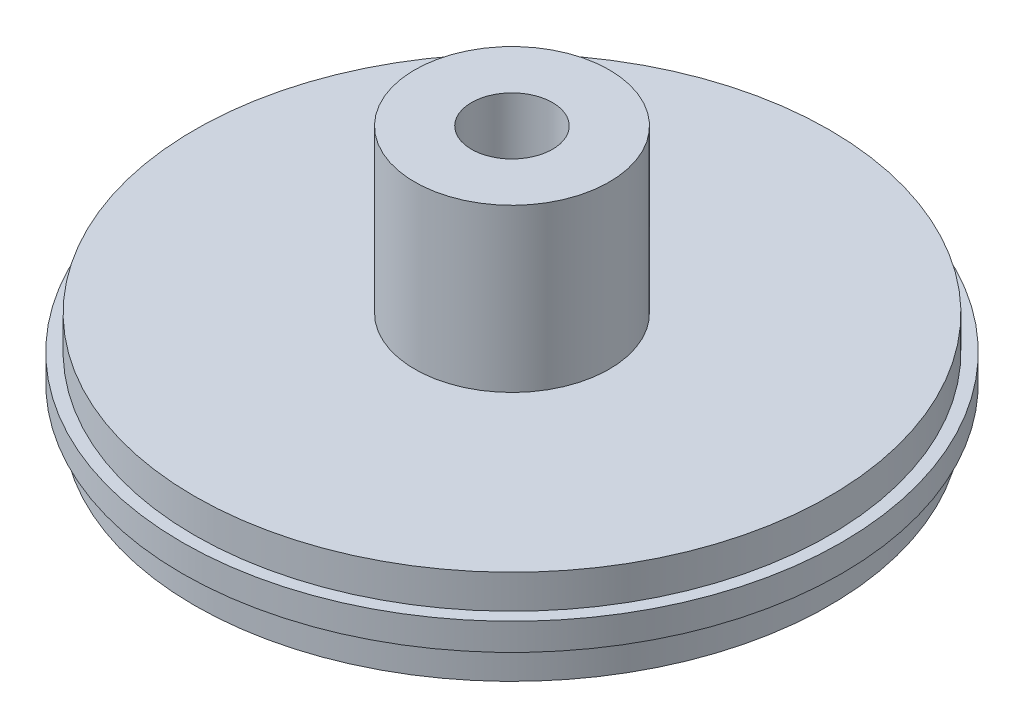
ISO-10303-21;
HEADER;
FILE_DESCRIPTION(('STEP AP214'),'2;1');
FILE_NAME('part.step','',(''),(''),'','','');
FILE_SCHEMA(('AUTOMOTIVE_DESIGN { 1 0 10303 214 1 1 1 1 }'));
ENDSEC;
DATA;
#1=APPLICATION_CONTEXT('core data for automotive mechanical design processes');
#2=APPLICATION_PROTOCOL_DEFINITION('international standard','automotive_design',2000,#1);
#3=PRODUCT_CONTEXT('',#1,'mechanical');
#4=PRODUCT('Part','Part','',(#3));
#5=PRODUCT_RELATED_PRODUCT_CATEGORY('part','',(#4));
#6=PRODUCT_DEFINITION_FORMATION('','',#4);
#7=PRODUCT_DEFINITION_CONTEXT('part definition',#1,'design');
#8=PRODUCT_DEFINITION('design','',#6,#7);
#9=PRODUCT_DEFINITION_SHAPE('','',#8);
#10=(LENGTH_UNIT() NAMED_UNIT(*) SI_UNIT(.MILLI.,.METRE.));
#11=(NAMED_UNIT(*) PLANE_ANGLE_UNIT() SI_UNIT($,.RADIAN.));
#12=(NAMED_UNIT(*) SI_UNIT($,.STERADIAN.) SOLID_ANGLE_UNIT());
#13=UNCERTAINTY_MEASURE_WITH_UNIT(LENGTH_MEASURE(1.E-05),#10,'distance_accuracy_value','');
#14=(GEOMETRIC_REPRESENTATION_CONTEXT(3) GLOBAL_UNCERTAINTY_ASSIGNED_CONTEXT((#13)) GLOBAL_UNIT_ASSIGNED_CONTEXT((#10,
#11,#12)) REPRESENTATION_CONTEXT('',''));
#15=CARTESIAN_POINT('',(0.,0.,0.));
#16=DIRECTION('',(0.,0.,1.));
#17=DIRECTION('',(1.,0.,0.));
#18=AXIS2_PLACEMENT_3D('',#15,#16,#17);
#19=CARTESIAN_POINT('',(0.,0.,0.));
#20=DIRECTION('',(0.,-1.,0.));
#21=DIRECTION('',(0.,0.,-1.));
#22=AXIS2_PLACEMENT_3D('',#19,#20,#21);
#23=CYLINDRICAL_SURFACE('',#22,11.75);
#24=CARTESIAN_POINT('',(0.,3.5,0.));
#25=DIRECTION('',(0.,-1.,0.));
#26=DIRECTION('',(0.,0.,-1.));
#27=AXIS2_PLACEMENT_3D('',#24,#25,#26);
#28=CIRCLE('',#27,11.75);
#29=CARTESIAN_POINT('',(0.,3.5,-11.75));
#30=VERTEX_POINT('',#29);
#31=EDGE_CURVE('E50',#30,#30,#28,.F.);
#32=ORIENTED_EDGE('',*,*,#31,.F.);
#33=EDGE_LOOP('',(#32));
#34=FACE_BOUND('',#33,.T.);
#35=CARTESIAN_POINT('',(0.,2.25,0.));
#36=DIRECTION('',(0.,-1.,0.));
#37=DIRECTION('',(0.,0.,-1.));
#38=AXIS2_PLACEMENT_3D('',#35,#36,#37);
#39=CIRCLE('',#38,11.75);
#40=CARTESIAN_POINT('',(0.,2.25,-11.75));
#41=VERTEX_POINT('',#40);
#42=EDGE_CURVE('E17',#41,#41,#39,.T.);
#43=ORIENTED_EDGE('',*,*,#42,.F.);
#44=EDGE_LOOP('',(#43));
#45=FACE_BOUND('',#44,.T.);
#46=ADVANCED_FACE('F14',(#34,#45),#23,.T.);
#47=CARTESIAN_POINT('',(0.,2.25,-11.75));
#48=DIRECTION('',(0.,1.,0.));
#49=DIRECTION('',(0.,0.,1.));
#50=AXIS2_PLACEMENT_3D('',#47,#48,#49);
#51=PLANE('',#50);
#52=CARTESIAN_POINT('',(0.,2.25,0.));
#53=DIRECTION('',(0.,-1.,0.));
#54=DIRECTION('',(0.,0.,-1.));
#55=AXIS2_PLACEMENT_3D('',#52,#53,#54);
#56=CIRCLE('',#55,12.2047);
#57=CARTESIAN_POINT('',(0.,2.25,-12.2047));
#58=VERTEX_POINT('',#57);
#59=EDGE_CURVE('E48',#58,#58,#56,.T.);
#60=ORIENTED_EDGE('',*,*,#59,.F.);
#61=EDGE_LOOP('',(#60));
#62=FACE_BOUND('',#61,.T.);
#63=ORIENTED_EDGE('',*,*,#42,.T.);
#64=EDGE_LOOP('',(#63));
#65=FACE_BOUND('',#64,.T.);
#66=ADVANCED_FACE('F57',(#62,#65),#51,.T.);
#67=CARTESIAN_POINT('',(0.,3.5,-3.6));
#68=DIRECTION('',(0.,1.,0.));
#69=DIRECTION('',(0.,0.,1.));
#70=AXIS2_PLACEMENT_3D('',#67,#68,#69);
#71=PLANE('',#70);
#72=ORIENTED_EDGE('',*,*,#31,.T.);
#73=EDGE_LOOP('',(#72));
#74=FACE_BOUND('',#73,.T.);
#75=CARTESIAN_POINT('',(0.,3.5,0.));
#76=DIRECTION('',(0.,-1.,0.));
#77=DIRECTION('',(0.,0.,-1.));
#78=AXIS2_PLACEMENT_3D('',#75,#76,#77);
#79=CIRCLE('',#78,3.6);
#80=CARTESIAN_POINT('',(0.,3.5,-3.6));
#81=VERTEX_POINT('',#80);
#82=EDGE_CURVE('E44',#81,#81,#79,.F.);
#83=ORIENTED_EDGE('',*,*,#82,.F.);
#84=EDGE_LOOP('',(#83));
#85=FACE_BOUND('',#84,.T.);
#86=ADVANCED_FACE('F65',(#74,#85),#71,.T.);
#87=CARTESIAN_POINT('',(0.,0.,0.));
#88=DIRECTION('',(0.,-1.,0.));
#89=DIRECTION('',(0.,0.,-1.));
#90=AXIS2_PLACEMENT_3D('',#87,#88,#89);
#91=CYLINDRICAL_SURFACE('',#90,12.2047);
#92=ORIENTED_EDGE('',*,*,#59,.T.);
#93=EDGE_LOOP('',(#92));
#94=FACE_BOUND('',#93,.T.);
#95=CARTESIAN_POINT('',(0.,1.25,0.));
#96=DIRECTION('',(0.,-1.,0.));
#97=DIRECTION('',(0.,0.,-1.));
#98=AXIS2_PLACEMENT_3D('',#95,#96,#97);
#99=CIRCLE('',#98,12.2047);
#100=CARTESIAN_POINT('',(0.,1.25,-12.2047));
#101=VERTEX_POINT('',#100);
#102=EDGE_CURVE('E41',#101,#101,#99,.T.);
#103=ORIENTED_EDGE('',*,*,#102,.F.);
#104=EDGE_LOOP('',(#103));
#105=FACE_BOUND('',#104,.T.);
#106=ADVANCED_FACE('F93',(#94,#105),#91,.T.);
#107=CARTESIAN_POINT('',(0.,0.,0.));
#108=DIRECTION('',(0.,-1.,0.));
#109=DIRECTION('',(0.,0.,-1.));
#110=AXIS2_PLACEMENT_3D('',#107,#108,#109);
#111=CYLINDRICAL_SURFACE('',#110,3.6);
#112=CARTESIAN_POINT('',(0.,9.5,0.));
#113=DIRECTION('',(0.,-1.,0.));
#114=DIRECTION('',(0.,0.,-1.));
#115=AXIS2_PLACEMENT_3D('',#112,#113,#114);
#116=CIRCLE('',#115,3.6);
#117=CARTESIAN_POINT('',(0.,9.5,-3.6));
#118=VERTEX_POINT('',#117);
#119=EDGE_CURVE('E38',#118,#118,#116,.F.);
#120=ORIENTED_EDGE('',*,*,#119,.F.);
#121=EDGE_LOOP('',(#120));
#122=FACE_BOUND('',#121,.T.);
#123=ORIENTED_EDGE('',*,*,#82,.T.);
#124=EDGE_LOOP('',(#123));
#125=FACE_BOUND('',#124,.T.);
#126=ADVANCED_FACE('F89',(#122,#125),#111,.T.);
#127=CARTESIAN_POINT('',(0.,1.25,-12.2047));
#128=DIRECTION('',(0.,-1.,0.));
#129=DIRECTION('',(0.,0.,-1.));
#130=AXIS2_PLACEMENT_3D('',#127,#128,#129);
#131=PLANE('',#130);
#132=CARTESIAN_POINT('',(0.,1.25,0.));
#133=DIRECTION('',(0.,-1.,0.));
#134=DIRECTION('',(0.,0.,-1.));
#135=AXIS2_PLACEMENT_3D('',#132,#133,#134);
#136=CIRCLE('',#135,11.75);
#137=CARTESIAN_POINT('',(0.,1.25,-11.75));
#138=VERTEX_POINT('',#137);
#139=EDGE_CURVE('E35',#138,#138,#136,.T.);
#140=ORIENTED_EDGE('',*,*,#139,.F.);
#141=EDGE_LOOP('',(#140));
#142=FACE_BOUND('',#141,.T.);
#143=ORIENTED_EDGE('',*,*,#102,.T.);
#144=EDGE_LOOP('',(#143));
#145=FACE_BOUND('',#144,.T.);
#146=ADVANCED_FACE('F85',(#142,#145),#131,.T.);
#147=CARTESIAN_POINT('',(0.,9.5,-1.5));
#148=DIRECTION('',(0.,1.,0.));
#149=DIRECTION('',(0.,0.,1.));
#150=AXIS2_PLACEMENT_3D('',#147,#148,#149);
#151=PLANE('',#150);
#152=ORIENTED_EDGE('',*,*,#119,.T.);
#153=EDGE_LOOP('',(#152));
#154=FACE_BOUND('',#153,.T.);
#155=CARTESIAN_POINT('',(0.,9.5,0.));
#156=DIRECTION('',(0.,-1.,0.));
#157=DIRECTION('',(0.,0.,-1.));
#158=AXIS2_PLACEMENT_3D('',#155,#156,#157);
#159=CIRCLE('',#158,1.5);
#160=CARTESIAN_POINT('',(0.,9.5,-1.5));
#161=VERTEX_POINT('',#160);
#162=EDGE_CURVE('E30',#161,#161,#159,.T.);
#163=ORIENTED_EDGE('',*,*,#162,.T.);
#164=EDGE_LOOP('',(#163));
#165=FACE_BOUND('',#164,.T.);
#166=ADVANCED_FACE('F81',(#154,#165),#151,.T.);
#167=CARTESIAN_POINT('',(0.,0.,0.));
#168=DIRECTION('',(0.,-1.,0.));
#169=DIRECTION('',(0.,0.,-1.));
#170=AXIS2_PLACEMENT_3D('',#167,#168,#169);
#171=CYLINDRICAL_SURFACE('',#170,11.75);
#172=ORIENTED_EDGE('',*,*,#139,.T.);
#173=EDGE_LOOP('',(#172));
#174=FACE_BOUND('',#173,.T.);
#175=CARTESIAN_POINT('',(0.,0.,0.));
#176=DIRECTION('',(0.,-1.,0.));
#177=DIRECTION('',(0.,0.,-1.));
#178=AXIS2_PLACEMENT_3D('',#175,#176,#177);
#179=CIRCLE('',#178,11.75);
#180=CARTESIAN_POINT('',(0.,0.,-11.75));
#181=VERTEX_POINT('',#180);
#182=EDGE_CURVE('E22',#181,#181,#179,.T.);
#183=ORIENTED_EDGE('',*,*,#182,.F.);
#184=EDGE_LOOP('',(#183));
#185=FACE_BOUND('',#184,.T.);
#186=ADVANCED_FACE('F74',(#174,#185),#171,.T.);
#187=CARTESIAN_POINT('',(0.,0.,0.));
#188=DIRECTION('',(0.,-1.,0.));
#189=DIRECTION('',(0.,0.,-1.));
#190=AXIS2_PLACEMENT_3D('',#187,#188,#189);
#191=CYLINDRICAL_SURFACE('',#190,1.5);
#192=CARTESIAN_POINT('',(0.,0.,0.));
#193=DIRECTION('',(0.,-1.,0.));
#194=DIRECTION('',(0.,0.,-1.));
#195=AXIS2_PLACEMENT_3D('',#192,#193,#194);
#196=CIRCLE('',#195,1.5);
#197=CARTESIAN_POINT('',(0.,0.,-1.5));
#198=VERTEX_POINT('',#197);
#199=EDGE_CURVE('E10',#198,#198,#196,.F.);
#200=ORIENTED_EDGE('',*,*,#199,.F.);
#201=EDGE_LOOP('',(#200));
#202=FACE_BOUND('',#201,.T.);
#203=ORIENTED_EDGE('',*,*,#162,.F.);
#204=EDGE_LOOP('',(#203));
#205=FACE_BOUND('',#204,.T.);
#206=ADVANCED_FACE('F69',(#202,#205),#191,.F.);
#207=CARTESIAN_POINT('',(0.,0.,-11.75));
#208=DIRECTION('',(0.,-1.,0.));
#209=DIRECTION('',(0.,0.,-1.));
#210=AXIS2_PLACEMENT_3D('',#207,#208,#209);
#211=PLANE('',#210);
#212=ORIENTED_EDGE('',*,*,#199,.T.);
#213=EDGE_LOOP('',(#212));
#214=FACE_BOUND('',#213,.T.);
#215=ORIENTED_EDGE('',*,*,#182,.T.);
#216=EDGE_LOOP('',(#215));
#217=FACE_BOUND('',#216,.T.);
#218=ADVANCED_FACE('F67',(#214,#217),#211,.T.);
#219=CLOSED_SHELL('',(#46,#66,#86,#106,#126,#146,#166,#186,#206,#218));
#220=MANIFOLD_SOLID_BREP('B1',#219);
#221=ADVANCED_BREP_SHAPE_REPRESENTATION('',(#18,#220),#14);
#222=SHAPE_DEFINITION_REPRESENTATION(#9,#221);
ENDSEC;
END-ISO-10303-21;
